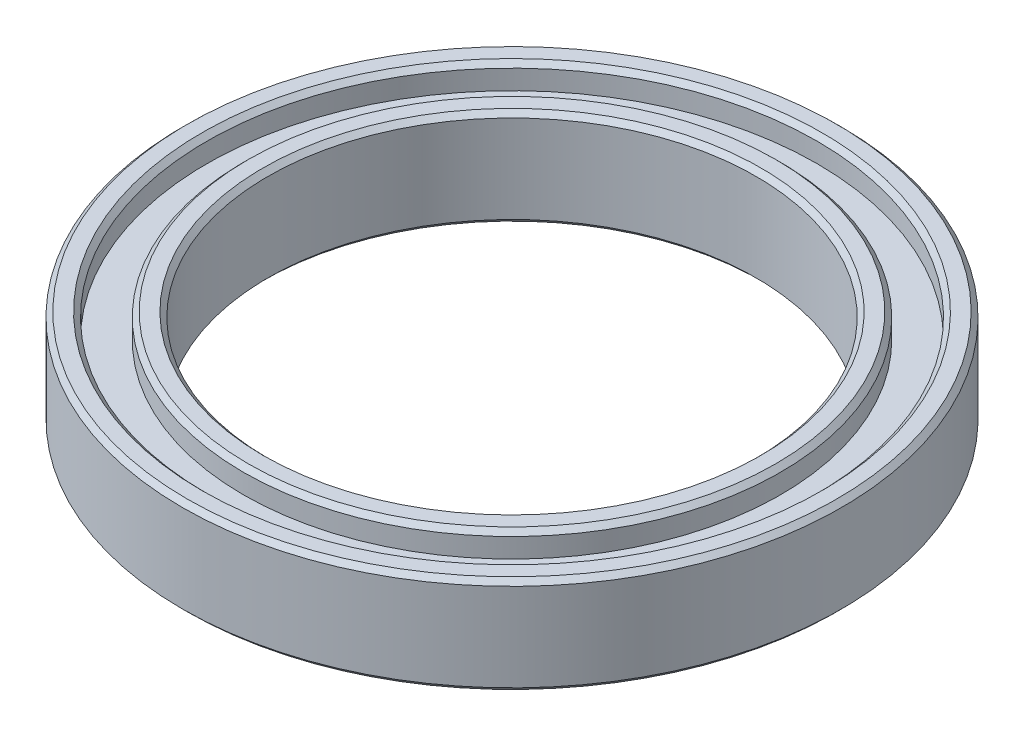
ISO-10303-21;
HEADER;
FILE_DESCRIPTION(('STEP AP214'),'2;1');
FILE_NAME('part.step','',(''),(''),'','','');
FILE_SCHEMA(('AUTOMOTIVE_DESIGN { 1 0 10303 214 1 1 1 1 }'));
ENDSEC;
DATA;
#1=APPLICATION_CONTEXT('core data for automotive mechanical design processes');
#2=APPLICATION_PROTOCOL_DEFINITION('international standard','automotive_design',2000,#1);
#3=PRODUCT_CONTEXT('',#1,'mechanical');
#4=PRODUCT('Part','Part','',(#3));
#5=PRODUCT_RELATED_PRODUCT_CATEGORY('part','',(#4));
#6=PRODUCT_DEFINITION_FORMATION('','',#4);
#7=PRODUCT_DEFINITION_CONTEXT('part definition',#1,'design');
#8=PRODUCT_DEFINITION('design','',#6,#7);
#9=PRODUCT_DEFINITION_SHAPE('','',#8);
#10=(LENGTH_UNIT() NAMED_UNIT(*) SI_UNIT(.MILLI.,.METRE.));
#11=(NAMED_UNIT(*) PLANE_ANGLE_UNIT() SI_UNIT($,.RADIAN.));
#12=(NAMED_UNIT(*) SI_UNIT($,.STERADIAN.) SOLID_ANGLE_UNIT());
#13=UNCERTAINTY_MEASURE_WITH_UNIT(LENGTH_MEASURE(1.E-05),#10,'distance_accuracy_value','');
#14=(GEOMETRIC_REPRESENTATION_CONTEXT(3) GLOBAL_UNCERTAINTY_ASSIGNED_CONTEXT((#13)) GLOBAL_UNIT_ASSIGNED_CONTEXT((#10,
#11,#12)) REPRESENTATION_CONTEXT('',''));
#15=CARTESIAN_POINT('',(0.,0.,0.));
#16=DIRECTION('',(0.,0.,1.));
#17=DIRECTION('',(1.,0.,0.));
#18=AXIS2_PLACEMENT_3D('',#15,#16,#17);
#19=CARTESIAN_POINT('',(0.,0.,0.));
#20=DIRECTION('',(0.,1.,0.));
#21=DIRECTION('',(0.,0.,1.));
#22=AXIS2_PLACEMENT_3D('',#19,#20,#21);
#23=PLANE('',#22);
#24=CARTESIAN_POINT('',(0.,0.,0.));
#25=DIRECTION('',(0.,1.,0.));
#26=DIRECTION('',(0.,0.,1.));
#27=AXIS2_PLACEMENT_3D('',#24,#25,#26);
#28=CIRCLE('',#27,10.8);
#29=CARTESIAN_POINT('',(0.,0.,10.8));
#30=VERTEX_POINT('',#29);
#31=EDGE_CURVE('E51',#30,#30,#28,.F.);
#32=ORIENTED_EDGE('',*,*,#31,.T.);
#33=EDGE_LOOP('',(#32));
#34=FACE_BOUND('',#33,.T.);
#35=CARTESIAN_POINT('',(0.,0.,0.));
#36=DIRECTION('',(0.,1.,0.));
#37=DIRECTION('',(0.,0.,1.));
#38=AXIS2_PLACEMENT_3D('',#35,#36,#37);
#39=CIRCLE('',#38,10.2);
#40=CARTESIAN_POINT('',(0.,0.,10.2));
#41=VERTEX_POINT('',#40);
#42=EDGE_CURVE('E55',#41,#41,#39,.T.);
#43=ORIENTED_EDGE('',*,*,#42,.T.);
#44=EDGE_LOOP('',(#43));
#45=FACE_BOUND('',#44,.T.);
#46=ADVANCED_FACE('F43',(#34,#45),#23,.F.);
#47=CARTESIAN_POINT('',(0.,4.,0.));
#48=DIRECTION('',(0.,1.,0.));
#49=DIRECTION('',(0.,0.,1.));
#50=AXIS2_PLACEMENT_3D('',#47,#48,#49);
#51=PLANE('',#50);
#52=CARTESIAN_POINT('',(0.,4.,0.));
#53=DIRECTION('',(0.,1.,0.));
#54=DIRECTION('',(0.,0.,1.));
#55=AXIS2_PLACEMENT_3D('',#52,#53,#54);
#56=CIRCLE('',#55,10.8);
#57=CARTESIAN_POINT('',(0.,4.,10.8));
#58=VERTEX_POINT('',#57);
#59=EDGE_CURVE('E94',#58,#58,#56,.T.);
#60=ORIENTED_EDGE('',*,*,#59,.T.);
#61=EDGE_LOOP('',(#60));
#62=FACE_BOUND('',#61,.T.);
#63=CARTESIAN_POINT('',(0.,4.,0.));
#64=DIRECTION('',(0.,1.,0.));
#65=DIRECTION('',(0.,0.,1.));
#66=AXIS2_PLACEMENT_3D('',#63,#64,#65);
#67=CIRCLE('',#66,10.2);
#68=CARTESIAN_POINT('',(0.,4.,10.2));
#69=VERTEX_POINT('',#68);
#70=EDGE_CURVE('E97',#69,#69,#67,.F.);
#71=ORIENTED_EDGE('',*,*,#70,.T.);
#72=EDGE_LOOP('',(#71));
#73=FACE_BOUND('',#72,.T.);
#74=ADVANCED_FACE('F134',(#62,#73),#51,.T.);
#75=CARTESIAN_POINT('',(0.,4.,0.));
#76=DIRECTION('',(0.,1.,0.));
#77=DIRECTION('',(0.,0.,1.));
#78=AXIS2_PLACEMENT_3D('',#75,#76,#77);
#79=CIRCLE('',#78,13.3);
#80=CARTESIAN_POINT('',(0.,4.,13.3));
#81=VERTEX_POINT('',#80);
#82=EDGE_CURVE('E79',#81,#81,#79,.T.);
#83=ORIENTED_EDGE('',*,*,#82,.T.);
#84=EDGE_LOOP('',(#83));
#85=FACE_BOUND('',#84,.T.);
#86=CARTESIAN_POINT('',(0.,4.,0.));
#87=DIRECTION('',(0.,1.,0.));
#88=DIRECTION('',(0.,0.,1.));
#89=AXIS2_PLACEMENT_3D('',#86,#87,#88);
#90=CIRCLE('',#89,12.7);
#91=CARTESIAN_POINT('',(0.,4.,12.7));
#92=VERTEX_POINT('',#91);
#93=EDGE_CURVE('E82',#92,#92,#90,.F.);
#94=ORIENTED_EDGE('',*,*,#93,.T.);
#95=EDGE_LOOP('',(#94));
#96=FACE_BOUND('',#95,.T.);
#97=ADVANCED_FACE('F140',(#85,#96),#51,.T.);
#98=CARTESIAN_POINT('',(0.,0.,0.));
#99=DIRECTION('',(0.,1.,0.));
#100=DIRECTION('',(0.,0.,1.));
#101=AXIS2_PLACEMENT_3D('',#98,#99,#100);
#102=CIRCLE('',#101,13.3);
#103=CARTESIAN_POINT('',(0.,0.,13.3));
#104=VERTEX_POINT('',#103);
#105=EDGE_CURVE('E64',#104,#104,#102,.F.);
#106=ORIENTED_EDGE('',*,*,#105,.T.);
#107=EDGE_LOOP('',(#106));
#108=FACE_BOUND('',#107,.T.);
#109=CARTESIAN_POINT('',(0.,0.,0.));
#110=DIRECTION('',(0.,1.,0.));
#111=DIRECTION('',(0.,0.,1.));
#112=AXIS2_PLACEMENT_3D('',#109,#110,#111);
#113=CIRCLE('',#112,12.7);
#114=CARTESIAN_POINT('',(0.,0.,12.7));
#115=VERTEX_POINT('',#114);
#116=EDGE_CURVE('E67',#115,#115,#113,.T.);
#117=ORIENTED_EDGE('',*,*,#116,.T.);
#118=EDGE_LOOP('',(#117));
#119=FACE_BOUND('',#118,.T.);
#120=ADVANCED_FACE('F136',(#108,#119),#23,.F.);
#121=CARTESIAN_POINT('',(0.,4.,0.));
#122=DIRECTION('',(0.,-1.,0.));
#123=DIRECTION('',(0.,0.,-1.));
#124=AXIS2_PLACEMENT_3D('',#121,#122,#123);
#125=CYLINDRICAL_SURFACE('',#124,13.5);
#126=CARTESIAN_POINT('',(0.,3.8,0.));
#127=DIRECTION('',(0.,1.,0.));
#128=DIRECTION('',(0.,0.,1.));
#129=AXIS2_PLACEMENT_3D('',#126,#127,#128);
#130=CIRCLE('',#129,13.5);
#131=CARTESIAN_POINT('',(0.,3.8,13.5));
#132=VERTEX_POINT('',#131);
#133=EDGE_CURVE('E73',#132,#132,#130,.F.);
#134=ORIENTED_EDGE('',*,*,#133,.T.);
#135=EDGE_LOOP('',(#134));
#136=FACE_BOUND('',#135,.T.);
#137=CARTESIAN_POINT('',(0.,0.200000000000006,0.));
#138=DIRECTION('',(0.,1.,0.));
#139=DIRECTION('',(0.,0.,1.));
#140=AXIS2_PLACEMENT_3D('',#137,#138,#139);
#141=CIRCLE('',#140,13.5);
#142=CARTESIAN_POINT('',(0.,0.200000000000006,13.5));
#143=VERTEX_POINT('',#142);
#144=EDGE_CURVE('E76',#143,#143,#141,.T.);
#145=ORIENTED_EDGE('',*,*,#144,.T.);
#146=EDGE_LOOP('',(#145));
#147=FACE_BOUND('',#146,.T.);
#148=ADVANCED_FACE('F146',(#136,#147),#125,.T.);
#149=CARTESIAN_POINT('',(0.,4.,0.));
#150=DIRECTION('',(0.,-1.,0.));
#151=DIRECTION('',(0.,0.,-1.));
#152=AXIS2_PLACEMENT_3D('',#149,#150,#151);
#153=CYLINDRICAL_SURFACE('',#152,10.);
#154=CARTESIAN_POINT('',(0.,3.8,0.));
#155=DIRECTION('',(0.,1.,0.));
#156=DIRECTION('',(0.,0.,1.));
#157=AXIS2_PLACEMENT_3D('',#154,#155,#156);
#158=CIRCLE('',#157,10.);
#159=CARTESIAN_POINT('',(0.,3.8,10.));
#160=VERTEX_POINT('',#159);
#161=EDGE_CURVE('E85',#160,#160,#158,.T.);
#162=ORIENTED_EDGE('',*,*,#161,.T.);
#163=EDGE_LOOP('',(#162));
#164=FACE_BOUND('',#163,.T.);
#165=CARTESIAN_POINT('',(0.,0.199999999999997,0.));
#166=DIRECTION('',(0.,1.,0.));
#167=DIRECTION('',(0.,0.,1.));
#168=AXIS2_PLACEMENT_3D('',#165,#166,#167);
#169=CIRCLE('',#168,10.);
#170=CARTESIAN_POINT('',(0.,0.199999999999997,10.));
#171=VERTEX_POINT('',#170);
#172=EDGE_CURVE('E88',#171,#171,#169,.F.);
#173=ORIENTED_EDGE('',*,*,#172,.T.);
#174=EDGE_LOOP('',(#173));
#175=FACE_BOUND('',#174,.T.);
#176=ADVANCED_FACE('F152',(#164,#175),#153,.F.);
#177=CARTESIAN_POINT('',(0.,3.,0.));
#178=DIRECTION('',(0.,1.,0.));
#179=DIRECTION('',(0.,0.,1.));
#180=AXIS2_PLACEMENT_3D('',#177,#178,#179);
#181=CYLINDRICAL_SURFACE('',#180,12.5);
#182=CARTESIAN_POINT('',(0.,3.80000000000001,0.));
#183=DIRECTION('',(0.,1.,0.));
#184=DIRECTION('',(0.,0.,1.));
#185=AXIS2_PLACEMENT_3D('',#182,#183,#184);
#186=CIRCLE('',#185,12.5);
#187=CARTESIAN_POINT('',(0.,3.80000000000001,12.5));
#188=VERTEX_POINT('',#187);
#189=EDGE_CURVE('E70',#188,#188,#186,.T.);
#190=ORIENTED_EDGE('',*,*,#189,.T.);
#191=EDGE_LOOP('',(#190));
#192=FACE_BOUND('',#191,.T.);
#193=CARTESIAN_POINT('',(0.,3.,0.));
#194=DIRECTION('',(0.,1.,0.));
#195=DIRECTION('',(0.,0.,1.));
#196=AXIS2_PLACEMENT_3D('',#193,#194,#195);
#197=CIRCLE('',#196,12.5);
#198=CARTESIAN_POINT('',(0.,3.,12.5));
#199=VERTEX_POINT('',#198);
#200=EDGE_CURVE('E100',#199,#199,#197,.T.);
#201=ORIENTED_EDGE('',*,*,#200,.F.);
#202=EDGE_LOOP('',(#201));
#203=FACE_BOUND('',#202,.T.);
#204=ADVANCED_FACE('F225',(#192,#203),#181,.F.);
#205=CARTESIAN_POINT('',(0.,3.,0.));
#206=DIRECTION('',(0.,1.,0.));
#207=DIRECTION('',(0.,0.,1.));
#208=AXIS2_PLACEMENT_3D('',#205,#206,#207);
#209=PLANE('',#208);
#210=CARTESIAN_POINT('',(0.,3.,0.));
#211=DIRECTION('',(0.,1.,0.));
#212=DIRECTION('',(0.,0.,1.));
#213=AXIS2_PLACEMENT_3D('',#210,#211,#212);
#214=CIRCLE('',#213,11.);
#215=CARTESIAN_POINT('',(0.,3.,11.));
#216=VERTEX_POINT('',#215);
#217=EDGE_CURVE('E103',#216,#216,#214,.T.);
#218=ORIENTED_EDGE('',*,*,#217,.F.);
#219=EDGE_LOOP('',(#218));
#220=FACE_BOUND('',#219,.T.);
#221=ORIENTED_EDGE('',*,*,#200,.T.);
#222=EDGE_LOOP('',(#221));
#223=FACE_BOUND('',#222,.T.);
#224=ADVANCED_FACE('F130',(#220,#223),#209,.T.);
#225=CARTESIAN_POINT('',(0.,3.,0.));
#226=DIRECTION('',(0.,1.,0.));
#227=DIRECTION('',(0.,0.,1.));
#228=AXIS2_PLACEMENT_3D('',#225,#226,#227);
#229=CYLINDRICAL_SURFACE('',#228,11.);
#230=CARTESIAN_POINT('',(0.,3.8,0.));
#231=DIRECTION('',(0.,1.,0.));
#232=DIRECTION('',(0.,0.,1.));
#233=AXIS2_PLACEMENT_3D('',#230,#231,#232);
#234=CIRCLE('',#233,11.);
#235=CARTESIAN_POINT('',(0.,3.8,11.));
#236=VERTEX_POINT('',#235);
#237=EDGE_CURVE('E91',#236,#236,#234,.F.);
#238=ORIENTED_EDGE('',*,*,#237,.T.);
#239=EDGE_LOOP('',(#238));
#240=FACE_BOUND('',#239,.T.);
#241=ORIENTED_EDGE('',*,*,#217,.T.);
#242=EDGE_LOOP('',(#241));
#243=FACE_BOUND('',#242,.T.);
#244=ADVANCED_FACE('F123',(#240,#243),#229,.T.);
#245=CARTESIAN_POINT('',(0.,1.,0.));
#246=DIRECTION('',(0.,-1.,0.));
#247=DIRECTION('',(0.,0.,-1.));
#248=AXIS2_PLACEMENT_3D('',#245,#246,#247);
#249=CYLINDRICAL_SURFACE('',#248,12.5);
#250=CARTESIAN_POINT('',(0.,0.200000000000007,0.));
#251=DIRECTION('',(0.,1.,0.));
#252=DIRECTION('',(0.,0.,1.));
#253=AXIS2_PLACEMENT_3D('',#250,#251,#252);
#254=CIRCLE('',#253,12.5);
#255=CARTESIAN_POINT('',(0.,0.200000000000007,12.5));
#256=VERTEX_POINT('',#255);
#257=EDGE_CURVE('E59',#256,#256,#254,.F.);
#258=ORIENTED_EDGE('',*,*,#257,.T.);
#259=EDGE_LOOP('',(#258));
#260=FACE_BOUND('',#259,.T.);
#261=CARTESIAN_POINT('',(0.,1.,0.));
#262=DIRECTION('',(0.,-1.,0.));
#263=DIRECTION('',(0.,0.,-1.));
#264=AXIS2_PLACEMENT_3D('',#261,#262,#263);
#265=CIRCLE('',#264,12.5);
#266=CARTESIAN_POINT('',(0.,1.,-12.5));
#267=VERTEX_POINT('',#266);
#268=EDGE_CURVE('E106',#267,#267,#265,.T.);
#269=ORIENTED_EDGE('',*,*,#268,.F.);
#270=EDGE_LOOP('',(#269));
#271=FACE_BOUND('',#270,.T.);
#272=ADVANCED_FACE('F118',(#260,#271),#249,.F.);
#273=CARTESIAN_POINT('',(0.,1.,0.));
#274=DIRECTION('',(0.,-1.,0.));
#275=DIRECTION('',(0.,0.,-1.));
#276=AXIS2_PLACEMENT_3D('',#273,#274,#275);
#277=PLANE('',#276);
#278=CARTESIAN_POINT('',(0.,1.,0.));
#279=DIRECTION('',(0.,-1.,0.));
#280=DIRECTION('',(0.,0.,-1.));
#281=AXIS2_PLACEMENT_3D('',#278,#279,#280);
#282=CIRCLE('',#281,11.);
#283=CARTESIAN_POINT('',(0.,1.,-11.));
#284=VERTEX_POINT('',#283);
#285=EDGE_CURVE('E109',#284,#284,#282,.T.);
#286=ORIENTED_EDGE('',*,*,#285,.F.);
#287=EDGE_LOOP('',(#286));
#288=FACE_BOUND('',#287,.T.);
#289=ORIENTED_EDGE('',*,*,#268,.T.);
#290=EDGE_LOOP('',(#289));
#291=FACE_BOUND('',#290,.T.);
#292=ADVANCED_FACE('F115',(#288,#291),#277,.T.);
#293=CARTESIAN_POINT('',(0.,1.,0.));
#294=DIRECTION('',(0.,-1.,0.));
#295=DIRECTION('',(0.,0.,-1.));
#296=AXIS2_PLACEMENT_3D('',#293,#294,#295);
#297=CYLINDRICAL_SURFACE('',#296,11.);
#298=CARTESIAN_POINT('',(0.,0.199999999999995,0.));
#299=DIRECTION('',(0.,1.,0.));
#300=DIRECTION('',(0.,0.,1.));
#301=AXIS2_PLACEMENT_3D('',#298,#299,#300);
#302=CIRCLE('',#301,11.);
#303=CARTESIAN_POINT('',(0.,0.199999999999995,11.));
#304=VERTEX_POINT('',#303);
#305=EDGE_CURVE('E10',#304,#304,#302,.T.);
#306=ORIENTED_EDGE('',*,*,#305,.T.);
#307=EDGE_LOOP('',(#306));
#308=FACE_BOUND('',#307,.T.);
#309=ORIENTED_EDGE('',*,*,#285,.T.);
#310=EDGE_LOOP('',(#309));
#311=FACE_BOUND('',#310,.T.);
#312=ADVANCED_FACE('F113',(#308,#311),#297,.T.);
#313=CARTESIAN_POINT('',(0.,4.,0.));
#314=DIRECTION('',(0.,-1.,0.));
#315=DIRECTION('',(0.,0.,-1.));
#316=AXIS2_PLACEMENT_3D('',#313,#314,#315);
#317=CONICAL_SURFACE('',#316,10.8,0.785398163397457);
#318=ORIENTED_EDGE('',*,*,#237,.F.);
#319=EDGE_LOOP('',(#318));
#320=FACE_BOUND('',#319,.T.);
#321=ORIENTED_EDGE('',*,*,#59,.F.);
#322=EDGE_LOOP('',(#321));
#323=FACE_BOUND('',#322,.T.);
#324=ADVANCED_FACE('F206',(#320,#323),#317,.T.);
#325=CARTESIAN_POINT('',(0.,3.8,0.));
#326=DIRECTION('',(0.,1.,0.));
#327=DIRECTION('',(0.,0.,1.));
#328=AXIS2_PLACEMENT_3D('',#325,#326,#327);
#329=CONICAL_SURFACE('',#328,10.,0.785398163397461);
#330=ORIENTED_EDGE('',*,*,#70,.F.);
#331=EDGE_LOOP('',(#330));
#332=FACE_BOUND('',#331,.T.);
#333=ORIENTED_EDGE('',*,*,#161,.F.);
#334=EDGE_LOOP('',(#333));
#335=FACE_BOUND('',#334,.T.);
#336=ADVANCED_FACE('F199',(#332,#335),#329,.F.);
#337=CARTESIAN_POINT('',(0.,4.,0.));
#338=DIRECTION('',(0.,-1.,0.));
#339=DIRECTION('',(0.,0.,-1.));
#340=AXIS2_PLACEMENT_3D('',#337,#338,#339);
#341=CONICAL_SURFACE('',#340,13.3,0.785398163397461);
#342=ORIENTED_EDGE('',*,*,#133,.F.);
#343=EDGE_LOOP('',(#342));
#344=FACE_BOUND('',#343,.T.);
#345=ORIENTED_EDGE('',*,*,#82,.F.);
#346=EDGE_LOOP('',(#345));
#347=FACE_BOUND('',#346,.T.);
#348=ADVANCED_FACE('F192',(#344,#347),#341,.T.);
#349=CARTESIAN_POINT('',(0.,3.80000000000001,0.));
#350=DIRECTION('',(0.,1.,0.));
#351=DIRECTION('',(0.,0.,1.));
#352=AXIS2_PLACEMENT_3D('',#349,#350,#351);
#353=CONICAL_SURFACE('',#352,12.5,0.785398163397466);
#354=ORIENTED_EDGE('',*,*,#93,.F.);
#355=EDGE_LOOP('',(#354));
#356=FACE_BOUND('',#355,.T.);
#357=ORIENTED_EDGE('',*,*,#189,.F.);
#358=EDGE_LOOP('',(#357));
#359=FACE_BOUND('',#358,.T.);
#360=ADVANCED_FACE('F171',(#356,#359),#353,.F.);
#361=CARTESIAN_POINT('',(0.,0.200000000000006,0.));
#362=DIRECTION('',(0.,1.,0.));
#363=DIRECTION('',(0.,0.,1.));
#364=AXIS2_PLACEMENT_3D('',#361,#362,#363);
#365=CONICAL_SURFACE('',#364,13.5,0.785398163397448);
#366=ORIENTED_EDGE('',*,*,#105,.F.);
#367=EDGE_LOOP('',(#366));
#368=FACE_BOUND('',#367,.T.);
#369=ORIENTED_EDGE('',*,*,#144,.F.);
#370=EDGE_LOOP('',(#369));
#371=FACE_BOUND('',#370,.T.);
#372=ADVANCED_FACE('F163',(#368,#371),#365,.T.);
#373=CARTESIAN_POINT('',(0.,0.200000000000007,0.));
#374=DIRECTION('',(0.,-1.,0.));
#375=DIRECTION('',(0.,0.,-1.));
#376=AXIS2_PLACEMENT_3D('',#373,#374,#375);
#377=CONICAL_SURFACE('',#376,12.5,0.785398163397453);
#378=ORIENTED_EDGE('',*,*,#116,.F.);
#379=EDGE_LOOP('',(#378));
#380=FACE_BOUND('',#379,.T.);
#381=ORIENTED_EDGE('',*,*,#257,.F.);
#382=EDGE_LOOP('',(#381));
#383=FACE_BOUND('',#382,.T.);
#384=ADVANCED_FACE('F159',(#380,#383),#377,.F.);
#385=CARTESIAN_POINT('',(0.,0.,0.));
#386=DIRECTION('',(0.,1.,0.));
#387=DIRECTION('',(0.,0.,1.));
#388=AXIS2_PLACEMENT_3D('',#385,#386,#387);
#389=CONICAL_SURFACE('',#388,10.8,0.785398163397457);
#390=ORIENTED_EDGE('',*,*,#305,.F.);
#391=EDGE_LOOP('',(#390));
#392=FACE_BOUND('',#391,.T.);
#393=ORIENTED_EDGE('',*,*,#31,.F.);
#394=EDGE_LOOP('',(#393));
#395=FACE_BOUND('',#394,.T.);
#396=ADVANCED_FACE('F162',(#392,#395),#389,.T.);
#397=CARTESIAN_POINT('',(0.,0.,0.));
#398=DIRECTION('',(0.,-1.,0.));
#399=DIRECTION('',(0.,0.,-1.));
#400=AXIS2_PLACEMENT_3D('',#397,#398,#399);
#401=CONICAL_SURFACE('',#400,10.2,0.785398163397457);
#402=ORIENTED_EDGE('',*,*,#172,.F.);
#403=EDGE_LOOP('',(#402));
#404=FACE_BOUND('',#403,.T.);
#405=ORIENTED_EDGE('',*,*,#42,.F.);
#406=EDGE_LOOP('',(#405));
#407=FACE_BOUND('',#406,.T.);
#408=ADVANCED_FACE('F46',(#404,#407),#401,.F.);
#409=CLOSED_SHELL('',(#46,#74,#97,#120,#148,#176,#204,#224,#244,#272,#292,#312,#324,#336,#348,
#360,#372,#384,#396,#408));
#410=MANIFOLD_SOLID_BREP('B2',#409);
#411=ADVANCED_BREP_SHAPE_REPRESENTATION('',(#18,#410),#14);
#412=SHAPE_DEFINITION_REPRESENTATION(#9,#411);
ENDSEC;
END-ISO-10303-21;
